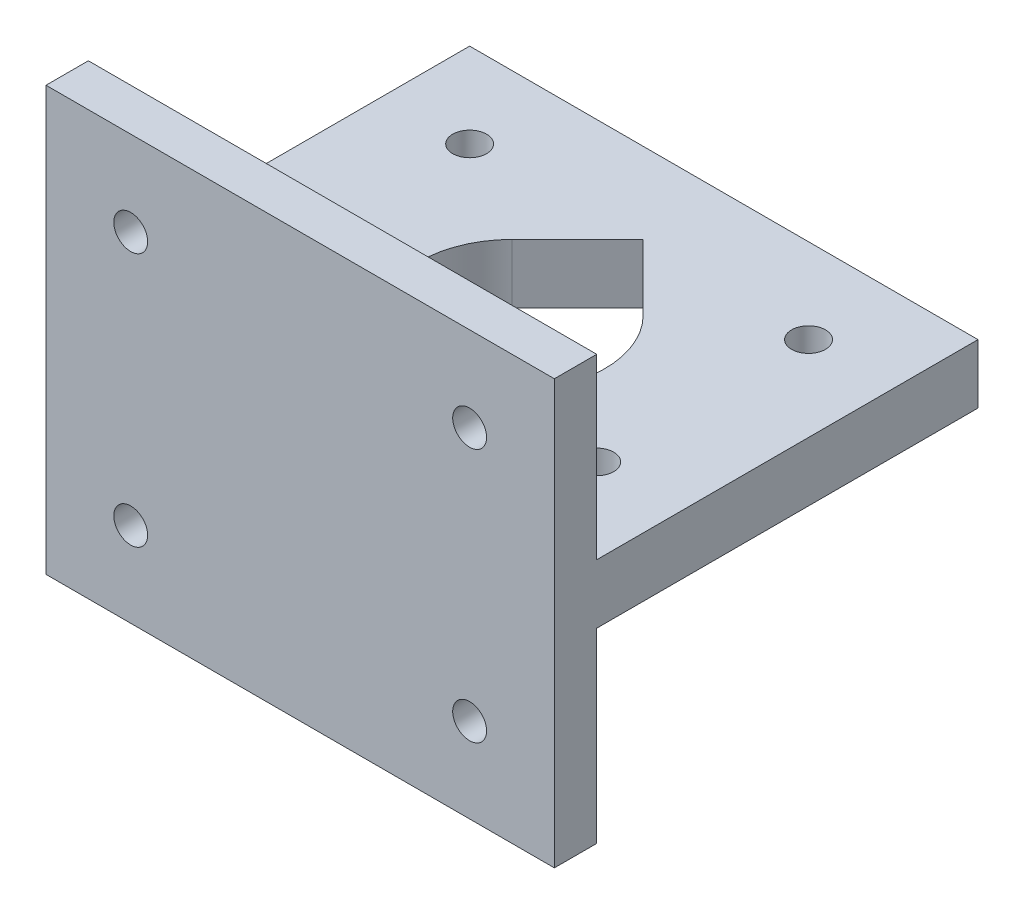
ISO-10303-21;
HEADER;
FILE_DESCRIPTION(('STEP AP214'),'2;1');
FILE_NAME('part.step','',(''),(''),'','','');
FILE_SCHEMA(('AUTOMOTIVE_DESIGN { 1 0 10303 214 1 1 1 1 }'));
ENDSEC;
DATA;
#1=APPLICATION_CONTEXT('core data for automotive mechanical design processes');
#2=APPLICATION_PROTOCOL_DEFINITION('international standard','automotive_design',2000,#1);
#3=PRODUCT_CONTEXT('',#1,'mechanical');
#4=PRODUCT('Part','Part','',(#3));
#5=PRODUCT_RELATED_PRODUCT_CATEGORY('part','',(#4));
#6=PRODUCT_DEFINITION_FORMATION('','',#4);
#7=PRODUCT_DEFINITION_CONTEXT('part definition',#1,'design');
#8=PRODUCT_DEFINITION('design','',#6,#7);
#9=PRODUCT_DEFINITION_SHAPE('','',#8);
#10=(LENGTH_UNIT() NAMED_UNIT(*) SI_UNIT(.MILLI.,.METRE.));
#11=(NAMED_UNIT(*) PLANE_ANGLE_UNIT() SI_UNIT($,.RADIAN.));
#12=(NAMED_UNIT(*) SI_UNIT($,.STERADIAN.) SOLID_ANGLE_UNIT());
#13=UNCERTAINTY_MEASURE_WITH_UNIT(LENGTH_MEASURE(1.E-05),#10,'distance_accuracy_value','');
#14=(GEOMETRIC_REPRESENTATION_CONTEXT(3) GLOBAL_UNCERTAINTY_ASSIGNED_CONTEXT((#13)) GLOBAL_UNIT_ASSIGNED_CONTEXT((#10,
#11,#12)) REPRESENTATION_CONTEXT('',''));
#15=CARTESIAN_POINT('',(0.,0.,0.));
#16=DIRECTION('',(0.,0.,1.));
#17=DIRECTION('',(1.,0.,0.));
#18=AXIS2_PLACEMENT_3D('',#15,#16,#17);
#19=CARTESIAN_POINT('',(0.,-3.,0.));
#20=DIRECTION('',(0.,1.,0.));
#21=DIRECTION('',(0.,0.,1.));
#22=AXIS2_PLACEMENT_3D('',#19,#20,#21);
#23=CYLINDRICAL_SURFACE('',#22,10.95);
#24=DIRECTION('',(0.,1.,0.));
#25=VECTOR('',#24,1.);
#26=CARTESIAN_POINT('',(-7.74281925399273,-3.,-7.74281925399265));
#27=LINE('',#26,#25);
#28=CARTESIAN_POINT('',(-7.74281925399274,7.,-7.74281925399265));
#29=VERTEX_POINT('',#28);
#30=CARTESIAN_POINT('',(-7.74281925399274,0.,-7.74281925399265));
#31=VERTEX_POINT('',#30);
#32=EDGE_CURVE('E12',#29,#31,#27,.F.);
#33=ORIENTED_EDGE('',*,*,#32,.F.);
#34=CARTESIAN_POINT('',(0.,7.,0.));
#35=DIRECTION('',(0.,1.,0.));
#36=DIRECTION('',(0.,0.,1.));
#37=AXIS2_PLACEMENT_3D('',#34,#35,#36);
#38=CIRCLE('',#37,10.95);
#39=CARTESIAN_POINT('',(7.74281925399274,7.,-7.74281925399265));
#40=VERTEX_POINT('',#39);
#41=EDGE_CURVE('E152',#29,#40,#38,.T.);
#42=ORIENTED_EDGE('',*,*,#41,.T.);
#43=DIRECTION('',(0.,1.,0.));
#44=VECTOR('',#43,1.);
#45=CARTESIAN_POINT('',(7.74281925399274,-3.,-7.74281925399265));
#46=LINE('',#45,#44);
#47=CARTESIAN_POINT('',(7.74281925399274,0.,-7.74281925399265));
#48=VERTEX_POINT('',#47);
#49=EDGE_CURVE('E65',#40,#48,#46,.F.);
#50=ORIENTED_EDGE('',*,*,#49,.T.);
#51=CARTESIAN_POINT('',(0.,0.,0.));
#52=DIRECTION('',(0.,-1.,0.));
#53=DIRECTION('',(0.,0.,-1.));
#54=AXIS2_PLACEMENT_3D('',#51,#52,#53);
#55=CIRCLE('',#54,10.95);
#56=EDGE_CURVE('E158',#48,#31,#55,.T.);
#57=ORIENTED_EDGE('',*,*,#56,.T.);
#58=EDGE_LOOP('',(#33,#42,#50,#57));
#59=FACE_BOUND('',#58,.T.);
#60=ADVANCED_FACE('F56',(#59),#23,.F.);
#61=CARTESIAN_POINT('',(0.,7.,0.));
#62=DIRECTION('',(0.,-1.,0.));
#63=DIRECTION('',(0.,0.,-1.));
#64=AXIS2_PLACEMENT_3D('',#61,#62,#63);
#65=PLANE('',#64);
#66=ORIENTED_EDGE('',*,*,#41,.F.);
#67=DIRECTION('',(-0.707106781186544,0.,0.707106781186551));
#68=VECTOR('',#67,1.);
#69=CARTESIAN_POINT('',(-7.74281925399274,7.,-7.74281925399265));
#70=LINE('',#69,#68);
#71=CARTESIAN_POINT('',(0.,7.,-15.4856385079855));
#72=VERTEX_POINT('',#71);
#73=EDGE_CURVE('E153',#72,#29,#70,.T.);
#74=ORIENTED_EDGE('',*,*,#73,.F.);
#75=DIRECTION('',(0.707106781186544,0.,0.707106781186551));
#76=VECTOR('',#75,1.);
#77=CARTESIAN_POINT('',(7.74281925399274,7.,-7.74281925399265));
#78=LINE('',#77,#76);
#79=EDGE_CURVE('E140',#72,#40,#78,.T.);
#80=ORIENTED_EDGE('',*,*,#79,.T.);
#81=EDGE_LOOP('',(#66,#74,#80));
#82=FACE_BOUND('',#81,.T.);
#83=CARTESIAN_POINT('',(-20.,7.,-15.));
#84=DIRECTION('',(0.,-1.,0.));
#85=DIRECTION('',(0.,0.,-1.));
#86=AXIS2_PLACEMENT_3D('',#83,#84,#85);
#87=CIRCLE('',#86,2.);
#88=CARTESIAN_POINT('',(-20.,7.,-17.));
#89=VERTEX_POINT('',#88);
#90=EDGE_CURVE('E195',#89,#89,#87,.T.);
#91=ORIENTED_EDGE('',*,*,#90,.T.);
#92=EDGE_LOOP('',(#91));
#93=FACE_BOUND('',#92,.T.);
#94=CARTESIAN_POINT('',(-20.,7.,10.));
#95=DIRECTION('',(0.,-1.,0.));
#96=DIRECTION('',(0.,0.,-1.));
#97=AXIS2_PLACEMENT_3D('',#94,#95,#96);
#98=CIRCLE('',#97,2.);
#99=CARTESIAN_POINT('',(-20.,7.,8.));
#100=VERTEX_POINT('',#99);
#101=EDGE_CURVE('E183',#100,#100,#98,.T.);
#102=ORIENTED_EDGE('',*,*,#101,.T.);
#103=EDGE_LOOP('',(#102));
#104=FACE_BOUND('',#103,.T.);
#105=DIRECTION('',(-1.,0.,0.));
#106=VECTOR('',#105,1.);
#107=CARTESIAN_POINT('',(0.,7.,20.));
#108=LINE('',#107,#106);
#109=CARTESIAN_POINT('',(30.,7.,20.));
#110=VERTEX_POINT('',#109);
#111=CARTESIAN_POINT('',(-30.,7.,20.));
#112=VERTEX_POINT('',#111);
#113=EDGE_CURVE('E80',#110,#112,#108,.T.);
#114=ORIENTED_EDGE('',*,*,#113,.F.);
#115=DIRECTION('',(0.,0.,-1.));
#116=VECTOR('',#115,1.);
#117=CARTESIAN_POINT('',(30.,7.,25.));
#118=LINE('',#117,#116);
#119=CARTESIAN_POINT('',(30.,7.,-25.));
#120=VERTEX_POINT('',#119);
#121=EDGE_CURVE('E264',#110,#120,#118,.T.);
#122=ORIENTED_EDGE('',*,*,#121,.T.);
#123=DIRECTION('',(-1.,0.,0.));
#124=VECTOR('',#123,1.);
#125=CARTESIAN_POINT('',(-30.,7.,-25.));
#126=LINE('',#125,#124);
#127=CARTESIAN_POINT('',(-30.,7.,-25.));
#128=VERTEX_POINT('',#127);
#129=EDGE_CURVE('E267',#120,#128,#126,.T.);
#130=ORIENTED_EDGE('',*,*,#129,.T.);
#131=DIRECTION('',(0.,0.,1.));
#132=VECTOR('',#131,1.);
#133=CARTESIAN_POINT('',(-30.,7.,25.));
#134=LINE('',#133,#132);
#135=EDGE_CURVE('E271',#128,#112,#134,.T.);
#136=ORIENTED_EDGE('',*,*,#135,.T.);
#137=EDGE_LOOP('',(#114,#122,#130,#136));
#138=FACE_BOUND('',#137,.T.);
#139=CARTESIAN_POINT('',(19.9999999999999,7.,10.));
#140=DIRECTION('',(0.,-1.,0.));
#141=DIRECTION('',(0.,0.,-1.));
#142=AXIS2_PLACEMENT_3D('',#139,#140,#141);
#143=CIRCLE('',#142,2.);
#144=CARTESIAN_POINT('',(19.9999999999999,7.,8.));
#145=VERTEX_POINT('',#144);
#146=EDGE_CURVE('E187',#145,#145,#143,.F.);
#147=ORIENTED_EDGE('',*,*,#146,.F.);
#148=EDGE_LOOP('',(#147));
#149=FACE_BOUND('',#148,.T.);
#150=CARTESIAN_POINT('',(20.0000000000001,7.,-14.9999999999998));
#151=DIRECTION('',(0.,-1.,0.));
#152=DIRECTION('',(0.,0.,-1.));
#153=AXIS2_PLACEMENT_3D('',#150,#151,#152);
#154=CIRCLE('',#153,2.);
#155=CARTESIAN_POINT('',(20.0000000000001,7.,-16.9999999999998));
#156=VERTEX_POINT('',#155);
#157=EDGE_CURVE('E191',#156,#156,#154,.F.);
#158=ORIENTED_EDGE('',*,*,#157,.F.);
#159=EDGE_LOOP('',(#158));
#160=FACE_BOUND('',#159,.T.);
#161=ADVANCED_FACE('F150',(#82,#93,#104,#138,#149,#160),#65,.F.);
#162=CARTESIAN_POINT('',(0.,0.,0.));
#163=DIRECTION('',(0.,-1.,0.));
#164=DIRECTION('',(0.,0.,-1.));
#165=AXIS2_PLACEMENT_3D('',#162,#163,#164);
#166=PLANE('',#165);
#167=DIRECTION('',(0.707106781186544,0.,-0.707106781186551));
#168=VECTOR('',#167,1.);
#169=CARTESIAN_POINT('',(-7.74281925399274,0.,-7.74281925399265));
#170=LINE('',#169,#168);
#171=CARTESIAN_POINT('',(0.,0.,-15.4856385079855));
#172=VERTEX_POINT('',#171);
#173=EDGE_CURVE('E159',#31,#172,#170,.T.);
#174=ORIENTED_EDGE('',*,*,#173,.F.);
#175=ORIENTED_EDGE('',*,*,#56,.F.);
#176=DIRECTION('',(-0.707106781186544,0.,-0.707106781186551));
#177=VECTOR('',#176,1.);
#178=CARTESIAN_POINT('',(7.74281925399274,0.,-7.74281925399265));
#179=LINE('',#178,#177);
#180=EDGE_CURVE('E72',#48,#172,#179,.T.);
#181=ORIENTED_EDGE('',*,*,#180,.T.);
#182=EDGE_LOOP('',(#174,#175,#181));
#183=FACE_BOUND('',#182,.T.);
#184=CARTESIAN_POINT('',(-20.,0.,-15.));
#185=DIRECTION('',(0.,-1.,0.));
#186=DIRECTION('',(0.,0.,-1.));
#187=AXIS2_PLACEMENT_3D('',#184,#185,#186);
#188=CIRCLE('',#187,2.);
#189=CARTESIAN_POINT('',(-20.,0.,-17.));
#190=VERTEX_POINT('',#189);
#191=EDGE_CURVE('E163',#190,#190,#188,.T.);
#192=ORIENTED_EDGE('',*,*,#191,.F.);
#193=EDGE_LOOP('',(#192));
#194=FACE_BOUND('',#193,.T.);
#195=CARTESIAN_POINT('',(19.9999999999999,0.,10.));
#196=DIRECTION('',(0.,-1.,0.));
#197=DIRECTION('',(0.,0.,-1.));
#198=AXIS2_PLACEMENT_3D('',#195,#196,#197);
#199=CIRCLE('',#198,2.);
#200=CARTESIAN_POINT('',(19.9999999999999,0.,8.));
#201=VERTEX_POINT('',#200);
#202=EDGE_CURVE('E168',#201,#201,#199,.F.);
#203=ORIENTED_EDGE('',*,*,#202,.T.);
#204=EDGE_LOOP('',(#203));
#205=FACE_BOUND('',#204,.T.);
#206=CARTESIAN_POINT('',(-20.,0.,10.));
#207=DIRECTION('',(0.,-1.,0.));
#208=DIRECTION('',(0.,0.,-1.));
#209=AXIS2_PLACEMENT_3D('',#206,#207,#208);
#210=CIRCLE('',#209,2.);
#211=CARTESIAN_POINT('',(-20.,0.,8.));
#212=VERTEX_POINT('',#211);
#213=EDGE_CURVE('E172',#212,#212,#210,.T.);
#214=ORIENTED_EDGE('',*,*,#213,.F.);
#215=EDGE_LOOP('',(#214));
#216=FACE_BOUND('',#215,.T.);
#217=DIRECTION('',(0.,0.,-1.));
#218=VECTOR('',#217,1.);
#219=CARTESIAN_POINT('',(30.,0.,25.));
#220=LINE('',#219,#218);
#221=CARTESIAN_POINT('',(30.,0.,20.));
#222=VERTEX_POINT('',#221);
#223=CARTESIAN_POINT('',(30.,0.,-25.));
#224=VERTEX_POINT('',#223);
#225=EDGE_CURVE('E263',#222,#224,#220,.T.);
#226=ORIENTED_EDGE('',*,*,#225,.F.);
#227=DIRECTION('',(-1.,0.,0.));
#228=VECTOR('',#227,1.);
#229=CARTESIAN_POINT('',(0.,0.,20.));
#230=LINE('',#229,#228);
#231=CARTESIAN_POINT('',(-30.,0.,20.));
#232=VERTEX_POINT('',#231);
#233=EDGE_CURVE('E257',#222,#232,#230,.T.);
#234=ORIENTED_EDGE('',*,*,#233,.T.);
#235=DIRECTION('',(0.,0.,1.));
#236=VECTOR('',#235,1.);
#237=CARTESIAN_POINT('',(-30.,0.,25.));
#238=LINE('',#237,#236);
#239=CARTESIAN_POINT('',(-30.,0.,-25.));
#240=VERTEX_POINT('',#239);
#241=EDGE_CURVE('E268',#240,#232,#238,.T.);
#242=ORIENTED_EDGE('',*,*,#241,.F.);
#243=DIRECTION('',(-1.,0.,0.));
#244=VECTOR('',#243,1.);
#245=CARTESIAN_POINT('',(-30.,0.,-25.));
#246=LINE('',#245,#244);
#247=EDGE_CURVE('E277',#224,#240,#246,.T.);
#248=ORIENTED_EDGE('',*,*,#247,.F.);
#249=EDGE_LOOP('',(#226,#234,#242,#248));
#250=FACE_BOUND('',#249,.T.);
#251=CARTESIAN_POINT('',(20.0000000000001,0.,-14.9999999999998));
#252=DIRECTION('',(0.,-1.,0.));
#253=DIRECTION('',(0.,0.,-1.));
#254=AXIS2_PLACEMENT_3D('',#251,#252,#253);
#255=CIRCLE('',#254,2.);
#256=CARTESIAN_POINT('',(20.0000000000001,0.,-16.9999999999998));
#257=VERTEX_POINT('',#256);
#258=EDGE_CURVE('E173',#257,#257,#255,.F.);
#259=ORIENTED_EDGE('',*,*,#258,.T.);
#260=EDGE_LOOP('',(#259));
#261=FACE_BOUND('',#260,.T.);
#262=ADVANCED_FACE('F323',(#183,#194,#205,#216,#250,#261),#166,.T.);
#263=CARTESIAN_POINT('',(-30.,7.,25.));
#264=DIRECTION('',(0.,0.,-1.));
#265=DIRECTION('',(-1.,0.,0.));
#266=AXIS2_PLACEMENT_3D('',#263,#264,#265);
#267=PLANE('',#266);
#268=CARTESIAN_POINT('',(20.0000000000001,-11.9999999999998,25.));
#269=DIRECTION('',(0.,0.,1.));
#270=DIRECTION('',(1.,0.,0.));
#271=AXIS2_PLACEMENT_3D('',#268,#269,#270);
#272=CIRCLE('',#271,2.);
#273=CARTESIAN_POINT('',(22.0000000000001,-11.9999999999998,25.));
#274=VERTEX_POINT('',#273);
#275=EDGE_CURVE('E199',#274,#274,#272,.T.);
#276=ORIENTED_EDGE('',*,*,#275,.F.);
#277=EDGE_LOOP('',(#276));
#278=FACE_BOUND('',#277,.T.);
#279=CARTESIAN_POINT('',(-20.,18.,25.));
#280=DIRECTION('',(0.,0.,1.));
#281=DIRECTION('',(1.,0.,0.));
#282=AXIS2_PLACEMENT_3D('',#279,#280,#281);
#283=CIRCLE('',#282,2.);
#284=CARTESIAN_POINT('',(-18.,18.,25.));
#285=VERTEX_POINT('',#284);
#286=EDGE_CURVE('E208',#285,#285,#283,.T.);
#287=ORIENTED_EDGE('',*,*,#286,.F.);
#288=EDGE_LOOP('',(#287));
#289=FACE_BOUND('',#288,.T.);
#290=DIRECTION('',(0.,-1.,0.));
#291=VECTOR('',#290,1.);
#292=CARTESIAN_POINT('',(-30.,7.,25.));
#293=LINE('',#292,#291);
#294=CARTESIAN_POINT('',(-30.,28.,25.));
#295=VERTEX_POINT('',#294);
#296=CARTESIAN_POINT('',(-30.,-22.,25.));
#297=VERTEX_POINT('',#296);
#298=EDGE_CURVE('E285',#295,#297,#293,.T.);
#299=ORIENTED_EDGE('',*,*,#298,.T.);
#300=DIRECTION('',(1.,0.,0.));
#301=VECTOR('',#300,1.);
#302=CARTESIAN_POINT('',(-30.,-22.,25.));
#303=LINE('',#302,#301);
#304=CARTESIAN_POINT('',(30.,-22.,25.));
#305=VERTEX_POINT('',#304);
#306=EDGE_CURVE('E236',#297,#305,#303,.T.);
#307=ORIENTED_EDGE('',*,*,#306,.T.);
#308=DIRECTION('',(0.,-1.,0.));
#309=VECTOR('',#308,1.);
#310=CARTESIAN_POINT('',(30.,7.,25.));
#311=LINE('',#310,#309);
#312=CARTESIAN_POINT('',(30.,28.,25.));
#313=VERTEX_POINT('',#312);
#314=EDGE_CURVE('E274',#313,#305,#311,.T.);
#315=ORIENTED_EDGE('',*,*,#314,.F.);
#316=DIRECTION('',(1.,0.,0.));
#317=VECTOR('',#316,1.);
#318=CARTESIAN_POINT('',(-30.,28.,25.));
#319=LINE('',#318,#317);
#320=EDGE_CURVE('E220',#295,#313,#319,.T.);
#321=ORIENTED_EDGE('',*,*,#320,.F.);
#322=EDGE_LOOP('',(#299,#307,#315,#321));
#323=FACE_BOUND('',#322,.T.);
#324=CARTESIAN_POINT('',(-20.,-12.,25.));
#325=DIRECTION('',(0.,0.,1.));
#326=DIRECTION('',(1.,0.,0.));
#327=AXIS2_PLACEMENT_3D('',#324,#325,#326);
#328=CIRCLE('',#327,2.);
#329=CARTESIAN_POINT('',(-18.,-12.,25.));
#330=VERTEX_POINT('',#329);
#331=EDGE_CURVE('E203',#330,#330,#328,.F.);
#332=ORIENTED_EDGE('',*,*,#331,.T.);
#333=EDGE_LOOP('',(#332));
#334=FACE_BOUND('',#333,.T.);
#335=CARTESIAN_POINT('',(19.9999999999999,18.,25.));
#336=DIRECTION('',(0.,0.,1.));
#337=DIRECTION('',(1.,0.,0.));
#338=AXIS2_PLACEMENT_3D('',#335,#336,#337);
#339=CIRCLE('',#338,2.00000000000001);
#340=CARTESIAN_POINT('',(21.9999999999999,18.,25.));
#341=VERTEX_POINT('',#340);
#342=EDGE_CURVE('E204',#341,#341,#339,.F.);
#343=ORIENTED_EDGE('',*,*,#342,.T.);
#344=EDGE_LOOP('',(#343));
#345=FACE_BOUND('',#344,.T.);
#346=ADVANCED_FACE('F315',(#278,#289,#323,#334,#345),#267,.F.);
#347=CARTESIAN_POINT('',(-30.,28.,20.));
#348=DIRECTION('',(0.,0.,1.));
#349=DIRECTION('',(1.,0.,0.));
#350=AXIS2_PLACEMENT_3D('',#347,#348,#349);
#351=PLANE('',#350);
#352=CARTESIAN_POINT('',(20.0000000000001,-11.9999999999998,20.));
#353=DIRECTION('',(0.,0.,1.));
#354=DIRECTION('',(1.,0.,0.));
#355=AXIS2_PLACEMENT_3D('',#352,#353,#354);
#356=CIRCLE('',#355,2.);
#357=CARTESIAN_POINT('',(22.0000000000001,-11.9999999999998,20.));
#358=VERTEX_POINT('',#357);
#359=EDGE_CURVE('E302',#358,#358,#356,.T.);
#360=ORIENTED_EDGE('',*,*,#359,.T.);
#361=EDGE_LOOP('',(#360));
#362=FACE_BOUND('',#361,.T.);
#363=ORIENTED_EDGE('',*,*,#233,.F.);
#364=DIRECTION('',(0.,-1.,0.));
#365=VECTOR('',#364,1.);
#366=CARTESIAN_POINT('',(30.,28.,20.));
#367=LINE('',#366,#365);
#368=CARTESIAN_POINT('',(30.,-22.,20.));
#369=VERTEX_POINT('',#368);
#370=EDGE_CURVE('E252',#222,#369,#367,.T.);
#371=ORIENTED_EDGE('',*,*,#370,.T.);
#372=DIRECTION('',(-1.,0.,0.));
#373=VECTOR('',#372,1.);
#374=CARTESIAN_POINT('',(-30.,-22.,20.));
#375=LINE('',#374,#373);
#376=CARTESIAN_POINT('',(-30.,-22.,20.));
#377=VERTEX_POINT('',#376);
#378=EDGE_CURVE('E221',#369,#377,#375,.T.);
#379=ORIENTED_EDGE('',*,*,#378,.T.);
#380=DIRECTION('',(0.,-1.,0.));
#381=VECTOR('',#380,1.);
#382=CARTESIAN_POINT('',(-30.,28.,20.));
#383=LINE('',#382,#381);
#384=EDGE_CURVE('E231',#232,#377,#383,.T.);
#385=ORIENTED_EDGE('',*,*,#384,.F.);
#386=EDGE_LOOP('',(#363,#371,#379,#385));
#387=FACE_BOUND('',#386,.T.);
#388=CARTESIAN_POINT('',(-20.,-12.,20.));
#389=DIRECTION('',(0.,0.,1.));
#390=DIRECTION('',(1.,0.,0.));
#391=AXIS2_PLACEMENT_3D('',#388,#389,#390);
#392=CIRCLE('',#391,2.);
#393=CARTESIAN_POINT('',(-18.,-12.,20.));
#394=VERTEX_POINT('',#393);
#395=EDGE_CURVE('E237',#394,#394,#392,.F.);
#396=ORIENTED_EDGE('',*,*,#395,.F.);
#397=EDGE_LOOP('',(#396));
#398=FACE_BOUND('',#397,.T.);
#399=ADVANCED_FACE('F312',(#362,#387,#398),#351,.F.);
#400=CARTESIAN_POINT('',(-20.,18.,20.));
#401=DIRECTION('',(0.,0.,1.));
#402=DIRECTION('',(1.,0.,0.));
#403=AXIS2_PLACEMENT_3D('',#400,#401,#402);
#404=CIRCLE('',#403,2.);
#405=CARTESIAN_POINT('',(-18.,18.,20.));
#406=VERTEX_POINT('',#405);
#407=EDGE_CURVE('E215',#406,#406,#404,.T.);
#408=ORIENTED_EDGE('',*,*,#407,.T.);
#409=EDGE_LOOP('',(#408));
#410=FACE_BOUND('',#409,.T.);
#411=CARTESIAN_POINT('',(30.,28.,20.));
#412=VERTEX_POINT('',#411);
#413=EDGE_CURVE('E253',#412,#110,#367,.T.);
#414=ORIENTED_EDGE('',*,*,#413,.T.);
#415=ORIENTED_EDGE('',*,*,#113,.T.);
#416=CARTESIAN_POINT('',(-30.,28.,20.));
#417=VERTEX_POINT('',#416);
#418=EDGE_CURVE('E248',#417,#112,#383,.T.);
#419=ORIENTED_EDGE('',*,*,#418,.F.);
#420=DIRECTION('',(-1.,0.,0.));
#421=VECTOR('',#420,1.);
#422=CARTESIAN_POINT('',(-30.,28.,20.));
#423=LINE('',#422,#421);
#424=EDGE_CURVE('E228',#412,#417,#423,.T.);
#425=ORIENTED_EDGE('',*,*,#424,.F.);
#426=EDGE_LOOP('',(#414,#415,#419,#425));
#427=FACE_BOUND('',#426,.T.);
#428=CARTESIAN_POINT('',(19.9999999999999,18.,20.));
#429=DIRECTION('',(0.,0.,1.));
#430=DIRECTION('',(1.,0.,0.));
#431=AXIS2_PLACEMENT_3D('',#428,#429,#430);
#432=CIRCLE('',#431,2.00000000000001);
#433=CARTESIAN_POINT('',(21.9999999999999,18.,20.));
#434=VERTEX_POINT('',#433);
#435=EDGE_CURVE('E298',#434,#434,#432,.F.);
#436=ORIENTED_EDGE('',*,*,#435,.F.);
#437=EDGE_LOOP('',(#436));
#438=FACE_BOUND('',#437,.T.);
#439=ADVANCED_FACE('F314',(#410,#427,#438),#351,.F.);
#440=CARTESIAN_POINT('',(30.,7.,25.));
#441=DIRECTION('',(-1.,0.,0.));
#442=DIRECTION('',(0.,0.,1.));
#443=AXIS2_PLACEMENT_3D('',#440,#441,#442);
#444=PLANE('',#443);
#445=ORIENTED_EDGE('',*,*,#314,.T.);
#446=DIRECTION('',(0.,0.,-1.));
#447=VECTOR('',#446,1.);
#448=CARTESIAN_POINT('',(30.,-22.,25.));
#449=LINE('',#448,#447);
#450=EDGE_CURVE('E241',#305,#369,#449,.T.);
#451=ORIENTED_EDGE('',*,*,#450,.T.);
#452=ORIENTED_EDGE('',*,*,#370,.F.);
#453=ORIENTED_EDGE('',*,*,#225,.T.);
#454=DIRECTION('',(0.,-1.,0.));
#455=VECTOR('',#454,1.);
#456=CARTESIAN_POINT('',(30.,7.,-25.));
#457=LINE('',#456,#455);
#458=EDGE_CURVE('E147',#120,#224,#457,.T.);
#459=ORIENTED_EDGE('',*,*,#458,.F.);
#460=ORIENTED_EDGE('',*,*,#121,.F.);
#461=ORIENTED_EDGE('',*,*,#413,.F.);
#462=DIRECTION('',(0.,0.,-1.));
#463=VECTOR('',#462,1.);
#464=CARTESIAN_POINT('',(30.,28.,25.));
#465=LINE('',#464,#463);
#466=EDGE_CURVE('E225',#313,#412,#465,.T.);
#467=ORIENTED_EDGE('',*,*,#466,.F.);
#468=EDGE_LOOP('',(#445,#451,#452,#453,#459,#460,#461,#467));
#469=FACE_BOUND('',#468,.T.);
#470=ADVANCED_FACE('F58',(#469),#444,.F.);
#471=CARTESIAN_POINT('',(-30.,7.,-25.));
#472=DIRECTION('',(0.,0.,1.));
#473=DIRECTION('',(1.,0.,0.));
#474=AXIS2_PLACEMENT_3D('',#471,#472,#473);
#475=PLANE('',#474);
#476=ORIENTED_EDGE('',*,*,#247,.T.);
#477=DIRECTION('',(0.,-1.,0.));
#478=VECTOR('',#477,1.);
#479=CARTESIAN_POINT('',(-30.,7.,-25.));
#480=LINE('',#479,#478);
#481=EDGE_CURVE('E288',#128,#240,#480,.T.);
#482=ORIENTED_EDGE('',*,*,#481,.F.);
#483=ORIENTED_EDGE('',*,*,#129,.F.);
#484=ORIENTED_EDGE('',*,*,#458,.T.);
#485=EDGE_LOOP('',(#476,#482,#483,#484));
#486=FACE_BOUND('',#485,.T.);
#487=ADVANCED_FACE('F379',(#486),#475,.F.);
#488=CARTESIAN_POINT('',(-30.,7.,25.));
#489=DIRECTION('',(1.,0.,0.));
#490=DIRECTION('',(0.,0.,-1.));
#491=AXIS2_PLACEMENT_3D('',#488,#489,#490);
#492=PLANE('',#491);
#493=ORIENTED_EDGE('',*,*,#298,.F.);
#494=DIRECTION('',(0.,0.,1.));
#495=VECTOR('',#494,1.);
#496=CARTESIAN_POINT('',(-30.,28.,25.));
#497=LINE('',#496,#495);
#498=EDGE_CURVE('E216',#417,#295,#497,.T.);
#499=ORIENTED_EDGE('',*,*,#498,.F.);
#500=ORIENTED_EDGE('',*,*,#418,.T.);
#501=ORIENTED_EDGE('',*,*,#135,.F.);
#502=ORIENTED_EDGE('',*,*,#481,.T.);
#503=ORIENTED_EDGE('',*,*,#241,.T.);
#504=ORIENTED_EDGE('',*,*,#384,.T.);
#505=DIRECTION('',(0.,0.,1.));
#506=VECTOR('',#505,1.);
#507=CARTESIAN_POINT('',(-30.,-22.,25.));
#508=LINE('',#507,#506);
#509=EDGE_CURVE('E232',#377,#297,#508,.T.);
#510=ORIENTED_EDGE('',*,*,#509,.T.);
#511=EDGE_LOOP('',(#493,#499,#500,#501,#502,#503,#504,#510));
#512=FACE_BOUND('',#511,.T.);
#513=ADVANCED_FACE('F374',(#512),#492,.F.);
#514=CARTESIAN_POINT('',(0.,-22.,0.));
#515=DIRECTION('',(0.,-1.,0.));
#516=DIRECTION('',(0.,0.,-1.));
#517=AXIS2_PLACEMENT_3D('',#514,#515,#516);
#518=PLANE('',#517);
#519=ORIENTED_EDGE('',*,*,#509,.F.);
#520=ORIENTED_EDGE('',*,*,#378,.F.);
#521=ORIENTED_EDGE('',*,*,#450,.F.);
#522=ORIENTED_EDGE('',*,*,#306,.F.);
#523=EDGE_LOOP('',(#519,#520,#521,#522));
#524=FACE_BOUND('',#523,.T.);
#525=ADVANCED_FACE('F371',(#524),#518,.T.);
#526=CARTESIAN_POINT('',(0.,28.,0.));
#527=DIRECTION('',(0.,-1.,0.));
#528=DIRECTION('',(0.,0.,-1.));
#529=AXIS2_PLACEMENT_3D('',#526,#527,#528);
#530=PLANE('',#529);
#531=ORIENTED_EDGE('',*,*,#498,.T.);
#532=ORIENTED_EDGE('',*,*,#320,.T.);
#533=ORIENTED_EDGE('',*,*,#466,.T.);
#534=ORIENTED_EDGE('',*,*,#424,.T.);
#535=EDGE_LOOP('',(#531,#532,#533,#534));
#536=FACE_BOUND('',#535,.T.);
#537=ADVANCED_FACE('F368',(#536),#530,.F.);
#538=CARTESIAN_POINT('',(-20.,18.,-25.));
#539=DIRECTION('',(0.,0.,1.));
#540=DIRECTION('',(1.,0.,0.));
#541=AXIS2_PLACEMENT_3D('',#538,#539,#540);
#542=CYLINDRICAL_SURFACE('',#541,2.);
#543=ORIENTED_EDGE('',*,*,#286,.T.);
#544=EDGE_LOOP('',(#543));
#545=FACE_BOUND('',#544,.T.);
#546=ORIENTED_EDGE('',*,*,#407,.F.);
#547=EDGE_LOOP('',(#546));
#548=FACE_BOUND('',#547,.T.);
#549=ADVANCED_FACE('F361',(#545,#548),#542,.F.);
#550=CARTESIAN_POINT('',(19.9999999999999,18.,-25.));
#551=DIRECTION('',(0.,0.,1.));
#552=DIRECTION('',(1.,0.,0.));
#553=AXIS2_PLACEMENT_3D('',#550,#551,#552);
#554=CYLINDRICAL_SURFACE('',#553,2.00000000000001);
#555=ORIENTED_EDGE('',*,*,#342,.F.);
#556=EDGE_LOOP('',(#555));
#557=FACE_BOUND('',#556,.T.);
#558=ORIENTED_EDGE('',*,*,#435,.T.);
#559=EDGE_LOOP('',(#558));
#560=FACE_BOUND('',#559,.T.);
#561=ADVANCED_FACE('F357',(#557,#560),#554,.F.);
#562=CARTESIAN_POINT('',(20.0000000000001,-11.9999999999998,-25.));
#563=DIRECTION('',(0.,0.,1.));
#564=DIRECTION('',(1.,0.,0.));
#565=AXIS2_PLACEMENT_3D('',#562,#563,#564);
#566=CYLINDRICAL_SURFACE('',#565,2.);
#567=ORIENTED_EDGE('',*,*,#275,.T.);
#568=EDGE_LOOP('',(#567));
#569=FACE_BOUND('',#568,.T.);
#570=ORIENTED_EDGE('',*,*,#359,.F.);
#571=EDGE_LOOP('',(#570));
#572=FACE_BOUND('',#571,.T.);
#573=ADVANCED_FACE('F354',(#569,#572),#566,.F.);
#574=CARTESIAN_POINT('',(-20.,-12.,-25.));
#575=DIRECTION('',(0.,0.,1.));
#576=DIRECTION('',(1.,0.,0.));
#577=AXIS2_PLACEMENT_3D('',#574,#575,#576);
#578=CYLINDRICAL_SURFACE('',#577,2.);
#579=ORIENTED_EDGE('',*,*,#331,.F.);
#580=EDGE_LOOP('',(#579));
#581=FACE_BOUND('',#580,.T.);
#582=ORIENTED_EDGE('',*,*,#395,.T.);
#583=EDGE_LOOP('',(#582));
#584=FACE_BOUND('',#583,.T.);
#585=ADVANCED_FACE('F310',(#581,#584),#578,.F.);
#586=CARTESIAN_POINT('',(-20.,50.,10.));
#587=DIRECTION('',(0.,-1.,0.));
#588=DIRECTION('',(0.,0.,-1.));
#589=AXIS2_PLACEMENT_3D('',#586,#587,#588);
#590=CYLINDRICAL_SURFACE('',#589,2.);
#591=ORIENTED_EDGE('',*,*,#213,.T.);
#592=EDGE_LOOP('',(#591));
#593=FACE_BOUND('',#592,.T.);
#594=ORIENTED_EDGE('',*,*,#101,.F.);
#595=EDGE_LOOP('',(#594));
#596=FACE_BOUND('',#595,.T.);
#597=ADVANCED_FACE('F342',(#593,#596),#590,.F.);
#598=CARTESIAN_POINT('',(19.9999999999999,50.,10.));
#599=DIRECTION('',(0.,-1.,0.));
#600=DIRECTION('',(0.,0.,-1.));
#601=AXIS2_PLACEMENT_3D('',#598,#599,#600);
#602=CYLINDRICAL_SURFACE('',#601,2.);
#603=ORIENTED_EDGE('',*,*,#202,.F.);
#604=EDGE_LOOP('',(#603));
#605=FACE_BOUND('',#604,.T.);
#606=ORIENTED_EDGE('',*,*,#146,.T.);
#607=EDGE_LOOP('',(#606));
#608=FACE_BOUND('',#607,.T.);
#609=ADVANCED_FACE('F338',(#605,#608),#602,.F.);
#610=CARTESIAN_POINT('',(20.0000000000001,50.,-14.9999999999998));
#611=DIRECTION('',(0.,-1.,0.));
#612=DIRECTION('',(0.,0.,-1.));
#613=AXIS2_PLACEMENT_3D('',#610,#611,#612);
#614=CYLINDRICAL_SURFACE('',#613,2.);
#615=ORIENTED_EDGE('',*,*,#258,.F.);
#616=EDGE_LOOP('',(#615));
#617=FACE_BOUND('',#616,.T.);
#618=ORIENTED_EDGE('',*,*,#157,.T.);
#619=EDGE_LOOP('',(#618));
#620=FACE_BOUND('',#619,.T.);
#621=ADVANCED_FACE('F341',(#617,#620),#614,.F.);
#622=CARTESIAN_POINT('',(-20.,50.,-15.));
#623=DIRECTION('',(0.,-1.,0.));
#624=DIRECTION('',(0.,0.,-1.));
#625=AXIS2_PLACEMENT_3D('',#622,#623,#624);
#626=CYLINDRICAL_SURFACE('',#625,2.);
#627=ORIENTED_EDGE('',*,*,#191,.T.);
#628=EDGE_LOOP('',(#627));
#629=FACE_BOUND('',#628,.T.);
#630=ORIENTED_EDGE('',*,*,#90,.F.);
#631=EDGE_LOOP('',(#630));
#632=FACE_BOUND('',#631,.T.);
#633=ADVANCED_FACE('F346',(#629,#632),#626,.F.);
#634=CARTESIAN_POINT('',(-7.74281925399274,-3.,-7.74281925399265));
#635=DIRECTION('',(-0.707106781186551,0.,-0.707106781186544));
#636=DIRECTION('',(-0.707106781186544,0.,0.707106781186551));
#637=AXIS2_PLACEMENT_3D('',#634,#635,#636);
#638=PLANE('',#637);
#639=ORIENTED_EDGE('',*,*,#173,.T.);
#640=DIRECTION('',(0.,1.,0.));
#641=VECTOR('',#640,1.);
#642=CARTESIAN_POINT('',(0.,-3.,-15.4856385079855));
#643=LINE('',#642,#641);
#644=EDGE_CURVE('E543',#172,#72,#643,.T.);
#645=ORIENTED_EDGE('',*,*,#644,.T.);
#646=ORIENTED_EDGE('',*,*,#73,.T.);
#647=ORIENTED_EDGE('',*,*,#32,.T.);
#648=EDGE_LOOP('',(#639,#645,#646,#647));
#649=FACE_BOUND('',#648,.T.);
#650=ADVANCED_FACE('F349',(#649),#638,.F.);
#651=CARTESIAN_POINT('',(7.74281925399274,-3.,-7.74281925399265));
#652=DIRECTION('',(-0.707106781186551,0.,0.707106781186544));
#653=DIRECTION('',(0.707106781186544,0.,0.707106781186551));
#654=AXIS2_PLACEMENT_3D('',#651,#652,#653);
#655=PLANE('',#654);
#656=ORIENTED_EDGE('',*,*,#49,.F.);
#657=ORIENTED_EDGE('',*,*,#79,.F.);
#658=ORIENTED_EDGE('',*,*,#644,.F.);
#659=ORIENTED_EDGE('',*,*,#180,.F.);
#660=EDGE_LOOP('',(#656,#657,#658,#659));
#661=FACE_BOUND('',#660,.T.);
#662=ADVANCED_FACE('F139',(#661),#655,.T.);
#663=CLOSED_SHELL('',(#60,#161,#262,#346,#399,#439,#470,#487,#513,#525,#537,#549,#561,#573,#585,
#597,#609,#621,#633,#650,#662));
#664=MANIFOLD_SOLID_BREP('B2',#663);
#665=ADVANCED_BREP_SHAPE_REPRESENTATION('',(#18,#664),#14);
#666=SHAPE_DEFINITION_REPRESENTATION(#9,#665);
ENDSEC;
END-ISO-10303-21;
